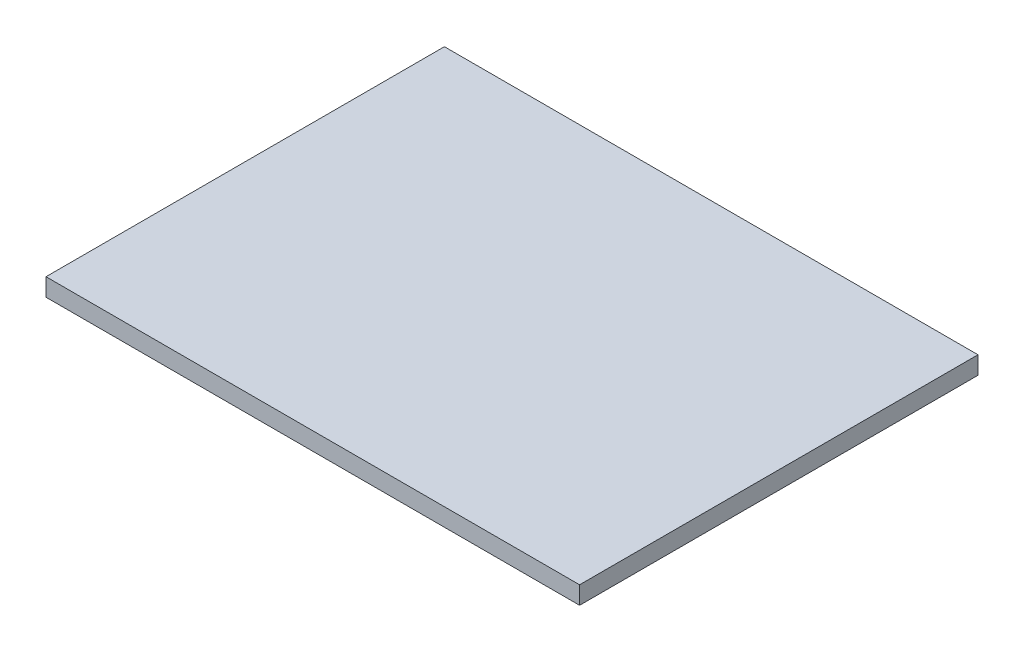
ISO-10303-21;
HEADER;
FILE_DESCRIPTION(('STEP AP214'),'2;1');
FILE_NAME('part.step','',(''),(''),'','','');
FILE_SCHEMA(('AUTOMOTIVE_DESIGN { 1 0 10303 214 1 1 1 1 }'));
ENDSEC;
DATA;
#1=APPLICATION_CONTEXT('core data for automotive mechanical design processes');
#2=APPLICATION_PROTOCOL_DEFINITION('international standard','automotive_design',2000,#1);
#3=PRODUCT_CONTEXT('',#1,'mechanical');
#4=PRODUCT('Part','Part','',(#3));
#5=PRODUCT_RELATED_PRODUCT_CATEGORY('part','',(#4));
#6=PRODUCT_DEFINITION_FORMATION('','',#4);
#7=PRODUCT_DEFINITION_CONTEXT('part definition',#1,'design');
#8=PRODUCT_DEFINITION('design','',#6,#7);
#9=PRODUCT_DEFINITION_SHAPE('','',#8);
#10=(LENGTH_UNIT() NAMED_UNIT(*) SI_UNIT(.MILLI.,.METRE.));
#11=(NAMED_UNIT(*) PLANE_ANGLE_UNIT() SI_UNIT($,.RADIAN.));
#12=(NAMED_UNIT(*) SI_UNIT($,.STERADIAN.) SOLID_ANGLE_UNIT());
#13=UNCERTAINTY_MEASURE_WITH_UNIT(LENGTH_MEASURE(1.E-05),#10,'distance_accuracy_value','');
#14=(GEOMETRIC_REPRESENTATION_CONTEXT(3) GLOBAL_UNCERTAINTY_ASSIGNED_CONTEXT((#13)) GLOBAL_UNIT_ASSIGNED_CONTEXT((#10,
#11,#12)) REPRESENTATION_CONTEXT('',''));
#15=CARTESIAN_POINT('',(0.,0.,0.));
#16=DIRECTION('',(0.,0.,1.));
#17=DIRECTION('',(1.,0.,0.));
#18=AXIS2_PLACEMENT_3D('',#15,#16,#17);
#19=CARTESIAN_POINT('',(-150.,10.,-112.));
#20=DIRECTION('',(1.,0.,0.));
#21=DIRECTION('',(0.,0.,-1.));
#22=AXIS2_PLACEMENT_3D('',#19,#20,#21);
#23=PLANE('',#22);
#24=DIRECTION('',(0.,0.,1.));
#25=VECTOR('',#24,1.);
#26=CARTESIAN_POINT('',(-150.,0.,-112.));
#27=LINE('',#26,#25);
#28=CARTESIAN_POINT('',(-150.,0.,-112.));
#29=VERTEX_POINT('',#28);
#30=CARTESIAN_POINT('',(-150.,0.,112.));
#31=VERTEX_POINT('',#30);
#32=EDGE_CURVE('E97',#29,#31,#27,.T.);
#33=ORIENTED_EDGE('',*,*,#32,.T.);
#34=DIRECTION('',(0.,-1.,0.));
#35=VECTOR('',#34,1.);
#36=CARTESIAN_POINT('',(-150.,10.,112.));
#37=LINE('',#36,#35);
#38=CARTESIAN_POINT('',(-150.,10.,112.));
#39=VERTEX_POINT('',#38);
#40=EDGE_CURVE('E11',#39,#31,#37,.T.);
#41=ORIENTED_EDGE('',*,*,#40,.F.);
#42=DIRECTION('',(0.,0.,1.));
#43=VECTOR('',#42,1.);
#44=CARTESIAN_POINT('',(-150.,10.,-112.));
#45=LINE('',#44,#43);
#46=CARTESIAN_POINT('',(-150.,10.,-112.));
#47=VERTEX_POINT('',#46);
#48=EDGE_CURVE('E85',#47,#39,#45,.T.);
#49=ORIENTED_EDGE('',*,*,#48,.F.);
#50=DIRECTION('',(0.,-1.,0.));
#51=VECTOR('',#50,1.);
#52=CARTESIAN_POINT('',(-150.,10.,-112.));
#53=LINE('',#52,#51);
#54=EDGE_CURVE('E93',#47,#29,#53,.T.);
#55=ORIENTED_EDGE('',*,*,#54,.T.);
#56=EDGE_LOOP('',(#33,#41,#49,#55));
#57=FACE_BOUND('',#56,.T.);
#58=ADVANCED_FACE('F34',(#57),#23,.F.);
#59=CARTESIAN_POINT('',(150.,10.,112.));
#60=DIRECTION('',(0.,0.,-1.));
#61=DIRECTION('',(-1.,0.,0.));
#62=AXIS2_PLACEMENT_3D('',#59,#60,#61);
#63=PLANE('',#62);
#64=DIRECTION('',(1.,0.,0.));
#65=VECTOR('',#64,1.);
#66=CARTESIAN_POINT('',(150.,0.,112.));
#67=LINE('',#66,#65);
#68=CARTESIAN_POINT('',(150.,0.,112.));
#69=VERTEX_POINT('',#68);
#70=EDGE_CURVE('E89',#31,#69,#67,.T.);
#71=ORIENTED_EDGE('',*,*,#70,.T.);
#72=DIRECTION('',(0.,-1.,0.));
#73=VECTOR('',#72,1.);
#74=CARTESIAN_POINT('',(150.,10.,112.));
#75=LINE('',#74,#73);
#76=CARTESIAN_POINT('',(150.,10.,112.));
#77=VERTEX_POINT('',#76);
#78=EDGE_CURVE('E42',#77,#69,#75,.T.);
#79=ORIENTED_EDGE('',*,*,#78,.F.);
#80=DIRECTION('',(1.,0.,0.));
#81=VECTOR('',#80,1.);
#82=CARTESIAN_POINT('',(150.,10.,112.));
#83=LINE('',#82,#81);
#84=EDGE_CURVE('E80',#39,#77,#83,.T.);
#85=ORIENTED_EDGE('',*,*,#84,.F.);
#86=ORIENTED_EDGE('',*,*,#40,.T.);
#87=EDGE_LOOP('',(#71,#79,#85,#86));
#88=FACE_BOUND('',#87,.T.);
#89=ADVANCED_FACE('F88',(#88),#63,.F.);
#90=CARTESIAN_POINT('',(150.,10.,-112.));
#91=DIRECTION('',(-1.,0.,0.));
#92=DIRECTION('',(0.,0.,1.));
#93=AXIS2_PLACEMENT_3D('',#90,#91,#92);
#94=PLANE('',#93);
#95=DIRECTION('',(0.,0.,-1.));
#96=VECTOR('',#95,1.);
#97=CARTESIAN_POINT('',(150.,0.,-112.));
#98=LINE('',#97,#96);
#99=CARTESIAN_POINT('',(150.,0.,-112.));
#100=VERTEX_POINT('',#99);
#101=EDGE_CURVE('E67',#69,#100,#98,.T.);
#102=ORIENTED_EDGE('',*,*,#101,.T.);
#103=DIRECTION('',(0.,-1.,0.));
#104=VECTOR('',#103,1.);
#105=CARTESIAN_POINT('',(150.,10.,-112.));
#106=LINE('',#105,#104);
#107=CARTESIAN_POINT('',(150.,10.,-112.));
#108=VERTEX_POINT('',#107);
#109=EDGE_CURVE('E90',#108,#100,#106,.T.);
#110=ORIENTED_EDGE('',*,*,#109,.F.);
#111=DIRECTION('',(0.,0.,-1.));
#112=VECTOR('',#111,1.);
#113=CARTESIAN_POINT('',(150.,10.,-112.));
#114=LINE('',#113,#112);
#115=EDGE_CURVE('E83',#77,#108,#114,.T.);
#116=ORIENTED_EDGE('',*,*,#115,.F.);
#117=ORIENTED_EDGE('',*,*,#78,.T.);
#118=EDGE_LOOP('',(#102,#110,#116,#117));
#119=FACE_BOUND('',#118,.T.);
#120=ADVANCED_FACE('F91',(#119),#94,.F.);
#121=CARTESIAN_POINT('',(150.,10.,-112.));
#122=DIRECTION('',(0.,0.,1.));
#123=DIRECTION('',(1.,0.,0.));
#124=AXIS2_PLACEMENT_3D('',#121,#122,#123);
#125=PLANE('',#124);
#126=DIRECTION('',(-1.,0.,0.));
#127=VECTOR('',#126,1.);
#128=CARTESIAN_POINT('',(150.,0.,-112.));
#129=LINE('',#128,#127);
#130=EDGE_CURVE('E73',#100,#29,#129,.T.);
#131=ORIENTED_EDGE('',*,*,#130,.T.);
#132=ORIENTED_EDGE('',*,*,#54,.F.);
#133=DIRECTION('',(-1.,0.,0.));
#134=VECTOR('',#133,1.);
#135=CARTESIAN_POINT('',(150.,10.,-112.));
#136=LINE('',#135,#134);
#137=EDGE_CURVE('E50',#108,#47,#136,.T.);
#138=ORIENTED_EDGE('',*,*,#137,.F.);
#139=ORIENTED_EDGE('',*,*,#109,.T.);
#140=EDGE_LOOP('',(#131,#132,#138,#139));
#141=FACE_BOUND('',#140,.T.);
#142=ADVANCED_FACE('F104',(#141),#125,.F.);
#143=CARTESIAN_POINT('',(0.,10.,0.));
#144=DIRECTION('',(0.,-1.,0.));
#145=DIRECTION('',(0.,0.,-1.));
#146=AXIS2_PLACEMENT_3D('',#143,#144,#145);
#147=PLANE('',#146);
#148=ORIENTED_EDGE('',*,*,#48,.T.);
#149=ORIENTED_EDGE('',*,*,#84,.T.);
#150=ORIENTED_EDGE('',*,*,#115,.T.);
#151=ORIENTED_EDGE('',*,*,#137,.T.);
#152=EDGE_LOOP('',(#148,#149,#150,#151));
#153=FACE_BOUND('',#152,.T.);
#154=ADVANCED_FACE('F81',(#153),#147,.F.);
#155=CARTESIAN_POINT('',(0.,0.,0.));
#156=DIRECTION('',(0.,-1.,0.));
#157=DIRECTION('',(0.,0.,-1.));
#158=AXIS2_PLACEMENT_3D('',#155,#156,#157);
#159=PLANE('',#158);
#160=ORIENTED_EDGE('',*,*,#32,.F.);
#161=ORIENTED_EDGE('',*,*,#130,.F.);
#162=ORIENTED_EDGE('',*,*,#101,.F.);
#163=ORIENTED_EDGE('',*,*,#70,.F.);
#164=EDGE_LOOP('',(#160,#161,#162,#163));
#165=FACE_BOUND('',#164,.T.);
#166=ADVANCED_FACE('F107',(#165),#159,.T.);
#167=CLOSED_SHELL('',(#58,#89,#120,#142,#154,#166));
#168=MANIFOLD_SOLID_BREP('B2',#167);
#169=ADVANCED_BREP_SHAPE_REPRESENTATION('',(#18,#168),#14);
#170=SHAPE_DEFINITION_REPRESENTATION(#9,#169);
ENDSEC;
END-ISO-10303-21;
